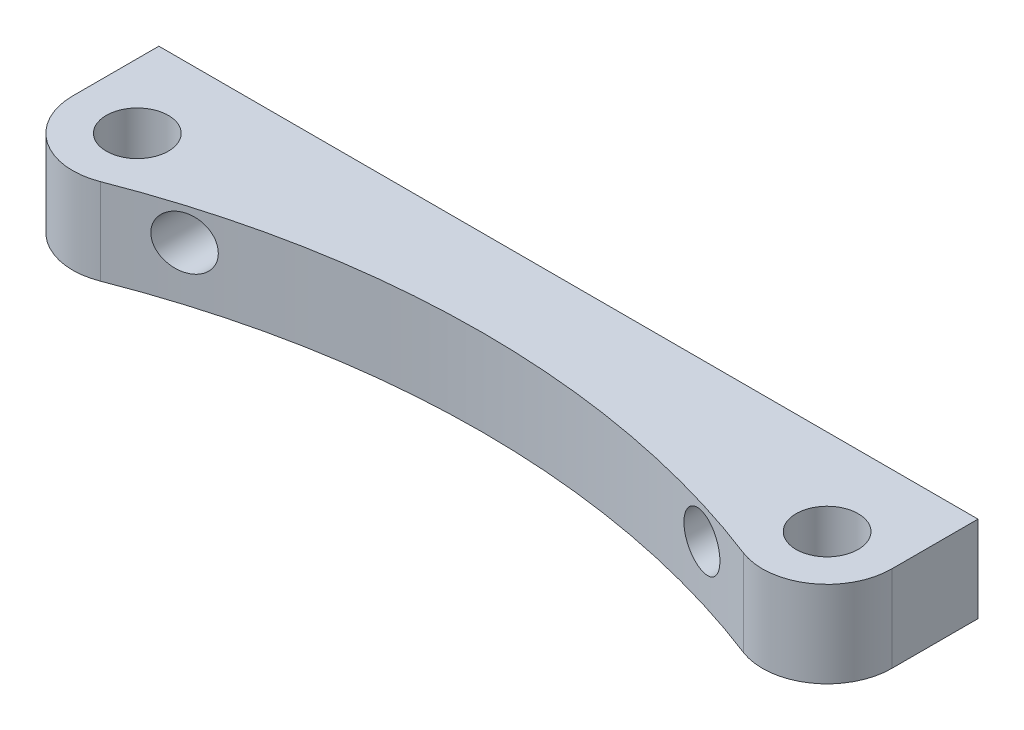
ISO-10303-21;
HEADER;
FILE_DESCRIPTION(('STEP AP214'),'2;1');
FILE_NAME('part.step','',(''),(''),'','','');
FILE_SCHEMA(('AUTOMOTIVE_DESIGN { 1 0 10303 214 1 1 1 1 }'));
ENDSEC;
DATA;
#1=APPLICATION_CONTEXT('core data for automotive mechanical design processes');
#2=APPLICATION_PROTOCOL_DEFINITION('international standard','automotive_design',2000,#1);
#3=PRODUCT_CONTEXT('',#1,'mechanical');
#4=PRODUCT('Part','Part','',(#3));
#5=PRODUCT_RELATED_PRODUCT_CATEGORY('part','',(#4));
#6=PRODUCT_DEFINITION_FORMATION('','',#4);
#7=PRODUCT_DEFINITION_CONTEXT('part definition',#1,'design');
#8=PRODUCT_DEFINITION('design','',#6,#7);
#9=PRODUCT_DEFINITION_SHAPE('','',#8);
#10=(LENGTH_UNIT() NAMED_UNIT(*) SI_UNIT(.MILLI.,.METRE.));
#11=(NAMED_UNIT(*) PLANE_ANGLE_UNIT() SI_UNIT($,.RADIAN.));
#12=(NAMED_UNIT(*) SI_UNIT($,.STERADIAN.) SOLID_ANGLE_UNIT());
#13=UNCERTAINTY_MEASURE_WITH_UNIT(LENGTH_MEASURE(1.E-05),#10,'distance_accuracy_value','');
#14=(GEOMETRIC_REPRESENTATION_CONTEXT(3) GLOBAL_UNCERTAINTY_ASSIGNED_CONTEXT((#13)) GLOBAL_UNIT_ASSIGNED_CONTEXT((#10,
#11,#12)) REPRESENTATION_CONTEXT('',''));
#15=CARTESIAN_POINT('',(0.,0.,0.));
#16=DIRECTION('',(0.,0.,1.));
#17=DIRECTION('',(1.,0.,0.));
#18=AXIS2_PLACEMENT_3D('',#15,#16,#17);
#19=CARTESIAN_POINT('',(25.4,6.35,65.3520833333333));
#20=DIRECTION('',(0.,-1.,0.));
#21=DIRECTION('',(0.,0.,-1.));
#22=AXIS2_PLACEMENT_3D('',#19,#20,#21);
#23=PLANE('',#22);
#24=CARTESIAN_POINT('',(25.4,6.35,65.3520833333333));
#25=DIRECTION('',(0.,-1.,0.));
#26=DIRECTION('',(0.,0.,-1.));
#27=AXIS2_PLACEMENT_3D('',#24,#25,#26);
#28=CIRCLE('',#27,65.3520833333333);
#29=CARTESIAN_POINT('',(1.72528301886792,6.35,4.43900943396227));
#30=VERTEX_POINT('',#29);
#31=CARTESIAN_POINT('',(49.0747169811321,6.35,4.43900943396226));
#32=VERTEX_POINT('',#31);
#33=EDGE_CURVE('E165',#30,#32,#28,.T.);
#34=ORIENTED_EDGE('',*,*,#33,.T.);
#35=CARTESIAN_POINT('',(50.8,6.35,0.));
#36=DIRECTION('',(0.,1.,0.));
#37=DIRECTION('',(0.,0.,1.));
#38=AXIS2_PLACEMENT_3D('',#35,#36,#37);
#39=CIRCLE('',#38,4.7625);
#40=CARTESIAN_POINT('',(55.5625,6.35,0.));
#41=VERTEX_POINT('',#40);
#42=EDGE_CURVE('E109',#32,#41,#39,.T.);
#43=ORIENTED_EDGE('',*,*,#42,.T.);
#44=DIRECTION('',(0.,0.,-1.));
#45=VECTOR('',#44,1.);
#46=CARTESIAN_POINT('',(55.5625,6.35,0.));
#47=LINE('',#46,#45);
#48=CARTESIAN_POINT('',(55.5625,6.35,-6.35));
#49=VERTEX_POINT('',#48);
#50=EDGE_CURVE('E125',#41,#49,#47,.T.);
#51=ORIENTED_EDGE('',*,*,#50,.T.);
#52=DIRECTION('',(-1.,0.,0.));
#53=VECTOR('',#52,1.);
#54=CARTESIAN_POINT('',(-4.7625,6.35,-6.35));
#55=LINE('',#54,#53);
#56=CARTESIAN_POINT('',(-4.7625,6.35,-6.35));
#57=VERTEX_POINT('',#56);
#58=EDGE_CURVE('E119',#49,#57,#55,.T.);
#59=ORIENTED_EDGE('',*,*,#58,.T.);
#60=DIRECTION('',(0.,0.,1.));
#61=VECTOR('',#60,1.);
#62=CARTESIAN_POINT('',(-4.7625,6.35,-6.35));
#63=LINE('',#62,#61);
#64=CARTESIAN_POINT('',(-4.7625,6.35,0.));
#65=VERTEX_POINT('',#64);
#66=EDGE_CURVE('E123',#57,#65,#63,.T.);
#67=ORIENTED_EDGE('',*,*,#66,.T.);
#68=CARTESIAN_POINT('',(0.,6.35,0.));
#69=DIRECTION('',(0.,1.,0.));
#70=DIRECTION('',(0.,0.,1.));
#71=AXIS2_PLACEMENT_3D('',#68,#69,#70);
#72=CIRCLE('',#71,4.7625);
#73=EDGE_CURVE('E66',#65,#30,#72,.T.);
#74=ORIENTED_EDGE('',*,*,#73,.T.);
#75=EDGE_LOOP('',(#34,#43,#51,#59,#67,#74));
#76=FACE_BOUND('',#75,.T.);
#77=CARTESIAN_POINT('',(0.,6.35,0.));
#78=DIRECTION('',(0.,1.,0.));
#79=DIRECTION('',(0.,0.,1.));
#80=AXIS2_PLACEMENT_3D('',#77,#78,#79);
#81=CIRCLE('',#80,2.286);
#82=CARTESIAN_POINT('',(0.,6.35,2.286));
#83=VERTEX_POINT('',#82);
#84=EDGE_CURVE('E154',#83,#83,#81,.T.);
#85=ORIENTED_EDGE('',*,*,#84,.F.);
#86=EDGE_LOOP('',(#85));
#87=FACE_BOUND('',#86,.T.);
#88=CARTESIAN_POINT('',(50.8,6.35,0.));
#89=DIRECTION('',(0.,1.,0.));
#90=DIRECTION('',(0.,0.,1.));
#91=AXIS2_PLACEMENT_3D('',#88,#89,#90);
#92=CIRCLE('',#91,2.28599999999999);
#93=CARTESIAN_POINT('',(50.8,6.35,2.28599999999999));
#94=VERTEX_POINT('',#93);
#95=EDGE_CURVE('E231',#94,#94,#92,.T.);
#96=ORIENTED_EDGE('',*,*,#95,.F.);
#97=EDGE_LOOP('',(#96));
#98=FACE_BOUND('',#97,.T.);
#99=ADVANCED_FACE('F45',(#76,#87,#98),#23,.F.);
#100=CARTESIAN_POINT('',(25.4,0.,65.3520833333333));
#101=DIRECTION('',(0.,-1.,0.));
#102=DIRECTION('',(0.,0.,-1.));
#103=AXIS2_PLACEMENT_3D('',#100,#101,#102);
#104=PLANE('',#103);
#105=CARTESIAN_POINT('',(0.,0.,0.));
#106=DIRECTION('',(0.,1.,0.));
#107=DIRECTION('',(0.,0.,1.));
#108=AXIS2_PLACEMENT_3D('',#105,#106,#107);
#109=CIRCLE('',#108,2.286);
#110=CARTESIAN_POINT('',(0.,0.,2.286));
#111=VERTEX_POINT('',#110);
#112=EDGE_CURVE('E234',#111,#111,#109,.T.);
#113=ORIENTED_EDGE('',*,*,#112,.T.);
#114=EDGE_LOOP('',(#113));
#115=FACE_BOUND('',#114,.T.);
#116=CARTESIAN_POINT('',(25.4,0.,65.3520833333333));
#117=DIRECTION('',(0.,-1.,0.));
#118=DIRECTION('',(0.,0.,-1.));
#119=AXIS2_PLACEMENT_3D('',#116,#117,#118);
#120=CIRCLE('',#119,65.3520833333333);
#121=CARTESIAN_POINT('',(1.72528301886792,0.,4.43900943396227));
#122=VERTEX_POINT('',#121);
#123=CARTESIAN_POINT('',(49.0747169811321,0.,4.43900943396226));
#124=VERTEX_POINT('',#123);
#125=EDGE_CURVE('E149',#122,#124,#120,.T.);
#126=ORIENTED_EDGE('',*,*,#125,.F.);
#127=CARTESIAN_POINT('',(0.,0.,0.));
#128=DIRECTION('',(0.,1.,0.));
#129=DIRECTION('',(0.,0.,1.));
#130=AXIS2_PLACEMENT_3D('',#127,#128,#129);
#131=CIRCLE('',#130,4.7625);
#132=CARTESIAN_POINT('',(-4.7625,0.,0.));
#133=VERTEX_POINT('',#132);
#134=EDGE_CURVE('E101',#133,#122,#131,.T.);
#135=ORIENTED_EDGE('',*,*,#134,.F.);
#136=DIRECTION('',(0.,0.,1.));
#137=VECTOR('',#136,1.);
#138=CARTESIAN_POINT('',(-4.7625,0.,-6.35));
#139=LINE('',#138,#137);
#140=CARTESIAN_POINT('',(-4.7625,0.,-6.35));
#141=VERTEX_POINT('',#140);
#142=EDGE_CURVE('E95',#141,#133,#139,.T.);
#143=ORIENTED_EDGE('',*,*,#142,.F.);
#144=DIRECTION('',(-1.,0.,0.));
#145=VECTOR('',#144,1.);
#146=CARTESIAN_POINT('',(-4.7625,0.,-6.35));
#147=LINE('',#146,#145);
#148=CARTESIAN_POINT('',(55.5625,0.,-6.35));
#149=VERTEX_POINT('',#148);
#150=EDGE_CURVE('E134',#149,#141,#147,.T.);
#151=ORIENTED_EDGE('',*,*,#150,.F.);
#152=DIRECTION('',(0.,0.,-1.));
#153=VECTOR('',#152,1.);
#154=CARTESIAN_POINT('',(55.5625,0.,0.));
#155=LINE('',#154,#153);
#156=CARTESIAN_POINT('',(55.5625,0.,0.));
#157=VERTEX_POINT('',#156);
#158=EDGE_CURVE('E157',#157,#149,#155,.T.);
#159=ORIENTED_EDGE('',*,*,#158,.F.);
#160=CARTESIAN_POINT('',(50.8,0.,0.));
#161=DIRECTION('',(0.,1.,0.));
#162=DIRECTION('',(0.,0.,1.));
#163=AXIS2_PLACEMENT_3D('',#160,#161,#162);
#164=CIRCLE('',#163,4.7625);
#165=EDGE_CURVE('E153',#124,#157,#164,.T.);
#166=ORIENTED_EDGE('',*,*,#165,.F.);
#167=EDGE_LOOP('',(#126,#135,#143,#151,#159,#166));
#168=FACE_BOUND('',#167,.T.);
#169=CARTESIAN_POINT('',(50.8,0.,0.));
#170=DIRECTION('',(0.,1.,0.));
#171=DIRECTION('',(0.,0.,1.));
#172=AXIS2_PLACEMENT_3D('',#169,#170,#171);
#173=CIRCLE('',#172,2.28599999999999);
#174=CARTESIAN_POINT('',(50.8,0.,2.28599999999999));
#175=VERTEX_POINT('',#174);
#176=EDGE_CURVE('E235',#175,#175,#173,.T.);
#177=ORIENTED_EDGE('',*,*,#176,.T.);
#178=EDGE_LOOP('',(#177));
#179=FACE_BOUND('',#178,.T.);
#180=ADVANCED_FACE('F178',(#115,#168,#179),#104,.T.);
#181=CARTESIAN_POINT('',(25.4,6.35,65.3520833333333));
#182=DIRECTION('',(0.,-1.,0.));
#183=DIRECTION('',(0.,0.,-1.));
#184=AXIS2_PLACEMENT_3D('',#181,#182,#183);
#185=CYLINDRICAL_SURFACE('',#184,65.3520833333333);
#186=CARTESIAN_POINT('',(4.44500000000001,3.96875000000114,3.4506877835806));
#187=CARTESIAN_POINT('',(4.44500526025842,3.86580721428467,3.45068576303521));
#188=CARTESIAN_POINT('',(4.45338011419821,3.76278563253451,3.44784896973304));
#189=CARTESIAN_POINT('',(4.48659194470384,3.55966157787404,3.43662118243721));
#190=CARTESIAN_POINT('',(4.51144952634682,3.45956292264863,3.42822323645762));
#191=CARTESIAN_POINT('',(4.57666492182714,3.26534365803786,3.40626276633443));
#192=CARTESIAN_POINT('',(4.6169969273315,3.17121339750449,3.39270884168087));
#193=CARTESIAN_POINT('',(4.71175923860379,2.99123307937674,3.36100353421809));
#194=CARTESIAN_POINT('',(4.76618751860219,2.90538183443948,3.34285281202096));
#195=CARTESIAN_POINT('',(4.88886565886284,2.74205166705979,3.30216450761695));
#196=CARTESIAN_POINT('',(4.95741311198408,2.66482004740458,3.27953296581455));
#197=CARTESIAN_POINT('',(5.10542276402552,2.52286807062076,3.23098393096233));
#198=CARTESIAN_POINT('',(5.18488756480302,2.45815070480738,3.2050656547211));
#199=CARTESIAN_POINT('',(5.35670311682752,2.33970055367038,3.14943402166661));
#200=CARTESIAN_POINT('',(5.44949635069849,2.28666778626967,3.11959647717944));
#201=CARTESIAN_POINT('',(5.6421399627345,2.19695522480582,3.05816721660841));
#202=CARTESIAN_POINT('',(5.7419919698629,2.16027921978256,3.02657509598144));
#203=CARTESIAN_POINT('',(5.9504065812174,2.10286934966305,2.96121449243142));
#204=CARTESIAN_POINT('',(6.05915875490684,2.0828625510928,2.92741015451493));
#205=CARTESIAN_POINT('',(6.27851340694779,2.06190511739777,2.85987005839934));
#206=CARTESIAN_POINT('',(6.38911611662742,2.06095688279196,2.82613430937441));
#207=CARTESIAN_POINT('',(6.61088076079701,2.07837186689689,2.75913310086106));
#208=CARTESIAN_POINT('',(6.72202372043538,2.09704175585941,2.72588359815574));
#209=CARTESIAN_POINT('',(6.93981856816563,2.15386640179247,2.66133917890188));
#210=CARTESIAN_POINT('',(7.04647062463011,2.19202042755983,2.63004418905359));
#211=CARTESIAN_POINT('',(7.25049964679196,2.28631946901828,2.5707041708875));
#212=CARTESIAN_POINT('',(7.34798807341334,2.34219745671342,2.54261882677844));
#213=CARTESIAN_POINT('',(7.532243242904,2.47077195294616,2.48995438400127));
#214=CARTESIAN_POINT('',(7.61901199737569,2.54346529861743,2.46537462735728));
#215=CARTESIAN_POINT('',(7.77605012885177,2.70094068410633,2.42118768650758));
#216=CARTESIAN_POINT('',(7.84678767239206,2.78521552796348,2.40143751425776));
#217=CARTESIAN_POINT('',(7.97302857602193,2.96531246037226,2.3663724926002));
#218=CARTESIAN_POINT('',(8.0285354652526,3.06113186648054,2.35105661566302));
#219=CARTESIAN_POINT('',(8.12050547507896,3.25765444516632,2.32577086310097));
#220=CARTESIAN_POINT('',(8.15761297803593,3.35803295605548,2.31561970982587));
#221=CARTESIAN_POINT('',(8.21454930612532,3.56392572979204,2.30007335887524));
#222=CARTESIAN_POINT('',(8.23438116850122,3.66943908643274,2.29467732519659));
#223=CARTESIAN_POINT('',(8.25576292052472,3.87958214959514,2.28886068977561));
#224=CARTESIAN_POINT('',(8.25778620442776,3.98416039455759,2.28831125311307));
#225=CARTESIAN_POINT('',(8.24472168127135,4.19215706602718,2.29186396575841));
#226=CARTESIAN_POINT('',(8.22963510189409,4.29557557521103,2.29596578132547));
#227=CARTESIAN_POINT('',(8.1830478293516,4.49754467372977,2.30867031923204));
#228=CARTESIAN_POINT('',(8.15166859115708,4.59612545458839,2.31723973935294));
#229=CARTESIAN_POINT('',(8.07361584023433,4.78652840501076,2.33864955949564));
#230=CARTESIAN_POINT('',(8.02694177488059,4.87835033021987,2.35149011384032));
#231=CARTESIAN_POINT('',(7.91908791596882,5.05399128737243,2.38133085099528));
#232=CARTESIAN_POINT('',(7.85772451690057,5.13768847590475,2.39838377908854));
#233=CARTESIAN_POINT('',(7.72275744519374,5.29358851234659,2.43614900707655));
#234=CARTESIAN_POINT('',(7.64915224313531,5.36578992183129,2.45686176422932));
#235=CARTESIAN_POINT('',(7.48952761556459,5.4989869293013,2.50212831554063));
#236=CARTESIAN_POINT('',(7.4032038678005,5.55958497314403,2.52677809531899));
#237=CARTESIAN_POINT('',(7.22240425594267,5.6654875896828,2.57885133300204));
#238=CARTESIAN_POINT('',(7.12792694220517,5.71078943576551,2.60627528428373));
#239=CARTESIAN_POINT('',(6.92974425517082,5.78660439454486,2.66432142736877));
#240=CARTESIAN_POINT('',(6.82582547439625,5.81649739905531,2.69502510249701));
#241=CARTESIAN_POINT('',(6.61487572462322,5.85830934992031,2.75794605239536));
#242=CARTESIAN_POINT('',(6.50784416919806,5.87022488678322,2.79016361308494));
#243=CARTESIAN_POINT('',(6.29003295953858,5.87601925427954,2.85634493593768));
#244=CARTESIAN_POINT('',(6.17924405506847,5.86930218780571,2.89033147239908));
#245=CARTESIAN_POINT('',(5.96042672179684,5.83676931376421,2.95808591379272));
#246=CARTESIAN_POINT('',(5.85239863225002,5.81095117057971,2.99185379147866));
#247=CARTESIAN_POINT('',(5.64085704458768,5.740393020123,3.0585562670018));
#248=CARTESIAN_POINT('',(5.53741257029161,5.69543149277177,3.09147616640282));
#249=CARTESIAN_POINT('',(5.339515696401,5.58758931209914,3.15495660073083));
#250=CARTESIAN_POINT('',(5.24506253751057,5.52471017367284,3.18551733484263));
#251=CARTESIAN_POINT('',(5.06987821268785,5.38391707253801,3.24258902998064));
#252=CARTESIAN_POINT('',(4.98891798403368,5.30631568401922,3.26916660030602));
#253=CARTESIAN_POINT('',(4.8413085480286,5.13727694054365,3.31789066554494));
#254=CARTESIAN_POINT('',(4.77465923451023,5.04583968823869,3.34003719333068));
#255=CARTESIAN_POINT('',(4.66084813706762,4.85614830931712,3.37800952448282));
#256=CARTESIAN_POINT('',(4.6129425043016,4.75838819698614,3.39407551520567));
#257=CARTESIAN_POINT('',(4.53438034948345,4.55555112544265,3.42048839681013));
#258=CARTESIAN_POINT('',(4.5036948272215,4.45048680466459,3.43084490245502));
#259=CARTESIAN_POINT('',(4.46986174311586,4.28190072694056,3.44227585416534));
#260=CARTESIAN_POINT('',(4.46055350476412,4.21968809009831,3.4454244052316));
#261=CARTESIAN_POINT('',(4.44812110185058,4.09457677228922,3.44963096167639));
#262=CARTESIAN_POINT('',(4.44499678444577,4.031678108317,3.45068901872398));
#263=CARTESIAN_POINT('',(4.44500000000001,3.96875000000114,3.4506877835806));
#264=B_SPLINE_CURVE_WITH_KNOTS('',3,(#186,#187,#188,#189,#190,#191,#192,#193,#194,#195,#196,
#197,#198,#199,#200,#201,#202,#203,#204,#205,#206,#207,#208,#209,#210,#211,#212,#213,#214,#215,
#216,#217,#218,#219,#220,#221,#222,#223,#224,#225,#226,#227,#228,#229,#230,#231,#232,#233,#234,
#235,#236,#237,#238,#239,#240,#241,#242,#243,#244,#245,#246,#247,#248,#249,#250,#251,#252,#253,
#254,#255,#256,#257,#258,#259,#260,#261,#262,#263),.UNSPECIFIED.,.T.,.F.,(4,2,2,2,2,2,2,2,2,2,2,
2,2,2,2,2,2,2,2,2,2,2,2,2,2,2,2,2,2,2,2,2,2,2,2,2,2,2,4),(0.,0.308591258986354,
0.617569017387571,0.926033685333858,1.23445404852988,1.55020025394281,1.8660218399623,
2.19743494287894,2.52892477773129,2.87421163121227,3.21954197498182,3.57035197335584,
3.92114880745476,4.26689331959875,4.61257285211167,4.94625349300115,5.27985675031989,
5.60076347769871,5.92161377482876,6.23390848054509,6.54618077963017,6.8561579482784,
7.16614631811143,7.48023266260613,7.79435827674391,8.11783477071175,8.44136889535924,
8.77706800752095,9.11283077823164,9.45945439955588,9.80612041188304,10.1569118634408,
10.5076736651387,10.8516862526775,11.1956962880239,11.5241780244045,11.8521048950922,
12.0407489464352,12.2293883351565),.UNSPECIFIED.);
#265=CARTESIAN_POINT('',(4.44500000000001,3.96875000000114,3.4506877835806));
#266=VERTEX_POINT('',#265);
#267=EDGE_CURVE('E221',#266,#266,#264,.T.);
#268=ORIENTED_EDGE('',*,*,#267,.F.);
#269=EDGE_LOOP('',(#268));
#270=FACE_BOUND('',#269,.T.);
#271=CARTESIAN_POINT('',(42.545,3.96875000000116,2.28906904597988));
#272=CARTESIAN_POINT('',(42.5450050643086,3.86460572202915,2.28907018508278));
#273=CARTESIAN_POINT('',(42.5535740323395,3.76038300209166,2.29139813684974));
#274=CARTESIAN_POINT('',(42.5875846605637,3.55485332625416,2.30065965930492));
#275=CARTESIAN_POINT('',(42.6130471336012,3.45355012805246,2.3075989111443));
#276=CARTESIAN_POINT('',(42.679946656476,3.25691840287198,2.32590279556924));
#277=CARTESIAN_POINT('',(42.7213652036646,3.1615831038282,2.33726230258428));
#278=CARTESIAN_POINT('',(42.8187952718039,2.97937066291823,2.36412489405095));
#279=CARTESIAN_POINT('',(42.8748038587474,2.89249182530618,2.37962714542701));
#280=CARTESIAN_POINT('',(43.0005300925144,2.7282221756436,2.41465058197506));
#281=CARTESIAN_POINT('',(43.0704296348869,2.65098215429581,2.43422527323091));
#282=CARTESIAN_POINT('',(43.2212811022936,2.50930213150605,2.47678715608142));
#283=CARTESIAN_POINT('',(43.3022349298877,2.44486433816051,2.49977493516435));
#284=CARTESIAN_POINT('',(43.4757266597538,2.32829296421746,2.54944566201452));
#285=CARTESIAN_POINT('',(43.5685615814364,2.27664335971942,2.57622653110682));
#286=CARTESIAN_POINT('',(43.7608874189924,2.18962205299311,2.6322089740827));
#287=CARTESIAN_POINT('',(43.8603795899909,2.15425343026119,2.66141100468965));
#288=CARTESIAN_POINT('',(44.0671556650734,2.09944043124734,2.72266419727761));
#289=CARTESIAN_POINT('',(44.1745918584485,2.08064352937723,2.75478115680512));
#290=CARTESIAN_POINT('',(44.3907943374296,2.06157866737181,2.82003327983481));
#291=CARTESIAN_POINT('',(44.4995608504148,2.06131392031177,2.85316861890569));
#292=CARTESIAN_POINT('',(44.7184996334404,2.07948405555549,2.92049007628441));
#293=CARTESIAN_POINT('',(44.8286284098643,2.09843295752609,2.9546800497374));
#294=CARTESIAN_POINT('',(45.0441505685323,2.15534595376294,3.02219558992482));
#295=CARTESIAN_POINT('',(45.1495435584797,2.19331162016221,3.05552108495241));
#296=CARTESIAN_POINT('',(45.3528246891312,2.28752581576697,3.12033097141375));
#297=CARTESIAN_POINT('',(45.4506918480246,2.34382332087265,3.15181016133973));
#298=CARTESIAN_POINT('',(45.6355676235567,2.47336106620977,3.21170956388303));
#299=CARTESIAN_POINT('',(45.7225775680184,2.54659923148857,3.24013015050485));
#300=CARTESIAN_POINT('',(45.8804666768501,2.70581927457704,3.29201563677613));
#301=CARTESIAN_POINT('',(45.951740159682,2.79137044931782,3.31560026047776));
#302=CARTESIAN_POINT('',(46.0787217171382,2.974423206599,3.35781135946427));
#303=CARTESIAN_POINT('',(46.1344348244938,3.07192091053105,3.3764394377646));
#304=CARTESIAN_POINT('',(46.2257739752314,3.27087346536213,3.40707425553223));
#305=CARTESIAN_POINT('',(46.262263551845,3.37188816451497,3.41936498781935));
#306=CARTESIAN_POINT('',(46.3178078254844,3.57911568064327,3.43810281379766));
#307=CARTESIAN_POINT('',(46.3368678298717,3.68532690487474,3.44455168634861));
#308=CARTESIAN_POINT('',(46.3563494493398,3.89492754559221,3.45114382238518));
#309=CARTESIAN_POINT('',(46.3575504562301,3.99823695172961,3.45155076303913));
#310=CARTESIAN_POINT('',(46.3432718790741,4.20355375202819,3.44671833937602));
#311=CARTESIAN_POINT('',(46.3277941031603,4.30556128611126,3.44147958710363));
#312=CARTESIAN_POINT('',(46.281043149417,4.50407850750082,3.42569619250922));
#313=CARTESIAN_POINT('',(46.2499714420569,4.60064127136061,3.41521923313396));
#314=CARTESIAN_POINT('',(46.1732315688996,4.78707958909985,3.38943914091974));
#315=CARTESIAN_POINT('',(46.1275621647891,4.87695457486168,3.37413559864631));
#316=CARTESIAN_POINT('',(46.0218503762254,5.04987294596122,3.33888111071076));
#317=CARTESIAN_POINT('',(45.9614878221304,5.13269920864278,3.31882695276512));
#318=CARTESIAN_POINT('',(45.828891037835,5.28710013842018,3.2750338366446));
#319=CARTESIAN_POINT('',(45.7566543556701,5.35867247563619,3.25129411747104));
#320=CARTESIAN_POINT('',(45.5987343608216,5.49210546737901,3.1997452519829));
#321=CARTESIAN_POINT('',(45.5125800660071,5.55335511103996,3.17179768104066));
#322=CARTESIAN_POINT('',(45.3319285220106,5.66057379163353,3.11365449310086));
#323=CARTESIAN_POINT('',(45.2374293133192,5.70653922746831,3.08345834836718));
#324=CARTESIAN_POINT('',(45.038046129112,5.78401443848769,3.02028278329888));
#325=CARTESIAN_POINT('',(44.9328839955136,5.81475728989814,2.98723922792261));
#326=CARTESIAN_POINT('',(44.7189988017785,5.85781597051453,2.92065190483882));
#327=CARTESIAN_POINT('',(44.610275136366,5.87012865076935,2.88710805263993));
#328=CARTESIAN_POINT('',(44.3894713787565,5.87606637249087,2.8196244093246));
#329=CARTESIAN_POINT('',(44.2773748978053,5.86922056573151,2.7856954180422));
#330=CARTESIAN_POINT('',(44.0557070272246,5.83586538502221,2.71924223647327));
#331=CARTESIAN_POINT('',(43.9461356755707,5.80935571554528,2.68671806730749));
#332=CARTESIAN_POINT('',(43.7334001615352,5.73737795162032,2.6241512474212));
#333=CARTESIAN_POINT('',(43.6302026458715,5.6920202488108,2.59409534816041));
#334=CARTESIAN_POINT('',(43.4327792794151,5.58336300194184,2.53708327602252));
#335=CARTESIAN_POINT('',(43.3385517269284,5.5200668700846,2.51012651500472));
#336=CARTESIAN_POINT('',(43.1649134568008,5.37931304158472,2.46082352034094));
#337=CARTESIAN_POINT('',(43.0851395010909,5.3023441296004,2.43836207576737));
#338=CARTESIAN_POINT('',(42.9396972383334,5.13506311357343,2.39765905473712));
#339=CARTESIAN_POINT('',(42.8740294110053,5.04475055591795,2.37941762179245));
#340=CARTESIAN_POINT('',(42.7614057193421,4.8571154361563,2.3482764498502));
#341=CARTESIAN_POINT('',(42.7138288586598,4.76019450360849,2.3351986931294));
#342=CARTESIAN_POINT('',(42.6356666250264,4.55933941909281,2.31377551427494));
#343=CARTESIAN_POINT('',(42.6050558272925,4.45541602436086,2.30542301064158));
#344=CARTESIAN_POINT('',(42.5706880639746,4.28703361124477,2.29605723924613));
#345=CARTESIAN_POINT('',(42.5610692365,4.22379937594162,2.29343964885791));
#346=CARTESIAN_POINT('',(42.5482237018417,4.09663661442816,2.28994521671631));
#347=CARTESIAN_POINT('',(42.5449968898575,4.03270809961823,2.28906834642289));
#348=CARTESIAN_POINT('',(42.545,3.96875000000116,2.28906904597988));
#349=B_SPLINE_CURVE_WITH_KNOTS('',3,(#271,#272,#273,#274,#275,#276,#277,#278,#279,#280,#281,
#282,#283,#284,#285,#286,#287,#288,#289,#290,#291,#292,#293,#294,#295,#296,#297,#298,#299,#300,
#301,#302,#303,#304,#305,#306,#307,#308,#309,#310,#311,#312,#313,#314,#315,#316,#317,#318,#319,
#320,#321,#322,#323,#324,#325,#326,#327,#328,#329,#330,#331,#332,#333,#334,#335,#336,#337,#338,
#339,#340,#341,#342,#343,#344,#345,#346,#347,#348),.UNSPECIFIED.,.T.,.F.,(4,2,2,2,2,2,2,2,2,2,2,
2,2,2,2,2,2,2,2,2,2,2,2,2,2,2,2,2,2,2,2,2,2,2,2,2,2,2,4),(0.,0.312195050028622,
0.624775441208668,0.936994450241489,1.24915072150064,1.5657015223318,1.88230687374917,
2.20950840130932,2.53677179260176,2.87631774369116,3.21592256456705,3.56485888985697,
3.91382406678881,4.26372930588894,4.61359171001709,4.95331753369235,5.29293335141337,
5.61560432849789,5.93817701846602,6.24662870755526,6.55504696102758,6.85957931307748,
7.16413750527213,7.47604320884716,7.78801340091584,8.1145789219609,8.44122133037308,
8.78297141338334,9.12477988063271,9.47506204503133,9.82534947390553,10.1736135815759,
10.5218114877489,10.8594284826698,11.1970569574112,11.5217380784013,11.845931318263,
12.0376627305215,12.2293909992129),.UNSPECIFIED.);
#350=CARTESIAN_POINT('',(42.545,3.96875000000116,2.28906904597988));
#351=VERTEX_POINT('',#350);
#352=EDGE_CURVE('E212',#351,#351,#349,.T.);
#353=ORIENTED_EDGE('',*,*,#352,.F.);
#354=EDGE_LOOP('',(#353));
#355=FACE_BOUND('',#354,.T.);
#356=ORIENTED_EDGE('',*,*,#125,.T.);
#357=DIRECTION('',(0.,-1.,0.));
#358=VECTOR('',#357,1.);
#359=CARTESIAN_POINT('',(49.0747169811321,6.35,4.43900943396226));
#360=LINE('',#359,#358);
#361=EDGE_CURVE('E11',#32,#124,#360,.T.);
#362=ORIENTED_EDGE('',*,*,#361,.F.);
#363=ORIENTED_EDGE('',*,*,#33,.F.);
#364=DIRECTION('',(0.,-1.,0.));
#365=VECTOR('',#364,1.);
#366=CARTESIAN_POINT('',(1.72528301886792,6.35,4.43900943396227));
#367=LINE('',#366,#365);
#368=EDGE_CURVE('E145',#30,#122,#367,.T.);
#369=ORIENTED_EDGE('',*,*,#368,.T.);
#370=EDGE_LOOP('',(#356,#362,#363,#369));
#371=FACE_BOUND('',#370,.T.);
#372=ADVANCED_FACE('F47',(#270,#355,#371),#185,.F.);
#373=CARTESIAN_POINT('',(50.8,6.35,0.));
#374=DIRECTION('',(0.,-1.,0.));
#375=DIRECTION('',(0.,0.,-1.));
#376=AXIS2_PLACEMENT_3D('',#373,#374,#375);
#377=CYLINDRICAL_SURFACE('',#376,4.7625);
#378=ORIENTED_EDGE('',*,*,#165,.T.);
#379=DIRECTION('',(0.,-1.,0.));
#380=VECTOR('',#379,1.);
#381=CARTESIAN_POINT('',(55.5625,6.35,0.));
#382=LINE('',#381,#380);
#383=EDGE_CURVE('E55',#41,#157,#382,.T.);
#384=ORIENTED_EDGE('',*,*,#383,.F.);
#385=ORIENTED_EDGE('',*,*,#42,.F.);
#386=ORIENTED_EDGE('',*,*,#361,.T.);
#387=EDGE_LOOP('',(#378,#384,#385,#386));
#388=FACE_BOUND('',#387,.T.);
#389=ADVANCED_FACE('F258',(#388),#377,.T.);
#390=CARTESIAN_POINT('',(55.5625,6.35,0.));
#391=DIRECTION('',(-1.,0.,0.));
#392=DIRECTION('',(0.,0.,1.));
#393=AXIS2_PLACEMENT_3D('',#390,#391,#392);
#394=PLANE('',#393);
#395=ORIENTED_EDGE('',*,*,#158,.T.);
#396=DIRECTION('',(0.,-1.,0.));
#397=VECTOR('',#396,1.);
#398=CARTESIAN_POINT('',(55.5625,6.35,-6.35));
#399=LINE('',#398,#397);
#400=EDGE_CURVE('E136',#49,#149,#399,.T.);
#401=ORIENTED_EDGE('',*,*,#400,.F.);
#402=ORIENTED_EDGE('',*,*,#50,.F.);
#403=ORIENTED_EDGE('',*,*,#383,.T.);
#404=EDGE_LOOP('',(#395,#401,#402,#403));
#405=FACE_BOUND('',#404,.T.);
#406=ADVANCED_FACE('F175',(#405),#394,.F.);
#407=CARTESIAN_POINT('',(-4.7625,6.35,-6.35));
#408=DIRECTION('',(0.,0.,1.));
#409=DIRECTION('',(1.,0.,0.));
#410=AXIS2_PLACEMENT_3D('',#407,#408,#409);
#411=PLANE('',#410);
#412=CARTESIAN_POINT('',(6.35000000000002,3.96875000000114,-6.35));
#413=DIRECTION('',(0.,0.,-1.));
#414=DIRECTION('',(-1.,0.,0.));
#415=AXIS2_PLACEMENT_3D('',#412,#413,#414);
#416=CIRCLE('',#415,1.905);
#417=CARTESIAN_POINT('',(4.44500000000001,3.96875000000114,-6.35));
#418=VERTEX_POINT('',#417);
#419=EDGE_CURVE('E230',#418,#418,#416,.T.);
#420=ORIENTED_EDGE('',*,*,#419,.F.);
#421=EDGE_LOOP('',(#420));
#422=FACE_BOUND('',#421,.T.);
#423=CARTESIAN_POINT('',(44.45,3.96875000000116,-6.35));
#424=DIRECTION('',(0.,0.,-1.));
#425=DIRECTION('',(-1.,0.,0.));
#426=AXIS2_PLACEMENT_3D('',#423,#424,#425);
#427=CIRCLE('',#426,1.905);
#428=CARTESIAN_POINT('',(42.545,3.96875000000116,-6.35));
#429=VERTEX_POINT('',#428);
#430=EDGE_CURVE('E220',#429,#429,#427,.T.);
#431=ORIENTED_EDGE('',*,*,#430,.F.);
#432=EDGE_LOOP('',(#431));
#433=FACE_BOUND('',#432,.T.);
#434=ORIENTED_EDGE('',*,*,#150,.T.);
#435=DIRECTION('',(0.,-1.,0.));
#436=VECTOR('',#435,1.);
#437=CARTESIAN_POINT('',(-4.7625,6.35,-6.35));
#438=LINE('',#437,#436);
#439=EDGE_CURVE('E131',#57,#141,#438,.T.);
#440=ORIENTED_EDGE('',*,*,#439,.F.);
#441=ORIENTED_EDGE('',*,*,#58,.F.);
#442=ORIENTED_EDGE('',*,*,#400,.T.);
#443=EDGE_LOOP('',(#434,#440,#441,#442));
#444=FACE_BOUND('',#443,.T.);
#445=ADVANCED_FACE('F132',(#422,#433,#444),#411,.F.);
#446=CARTESIAN_POINT('',(-4.7625,6.35,-6.35));
#447=DIRECTION('',(1.,0.,0.));
#448=DIRECTION('',(0.,0.,-1.));
#449=AXIS2_PLACEMENT_3D('',#446,#447,#448);
#450=PLANE('',#449);
#451=ORIENTED_EDGE('',*,*,#142,.T.);
#452=DIRECTION('',(0.,-1.,0.));
#453=VECTOR('',#452,1.);
#454=CARTESIAN_POINT('',(-4.7625,6.35,0.));
#455=LINE('',#454,#453);
#456=EDGE_CURVE('E137',#65,#133,#455,.T.);
#457=ORIENTED_EDGE('',*,*,#456,.F.);
#458=ORIENTED_EDGE('',*,*,#66,.F.);
#459=ORIENTED_EDGE('',*,*,#439,.T.);
#460=EDGE_LOOP('',(#451,#457,#458,#459));
#461=FACE_BOUND('',#460,.T.);
#462=ADVANCED_FACE('F139',(#461),#450,.F.);
#463=CARTESIAN_POINT('',(0.,6.35,0.));
#464=DIRECTION('',(0.,-1.,0.));
#465=DIRECTION('',(0.,0.,-1.));
#466=AXIS2_PLACEMENT_3D('',#463,#464,#465);
#467=CYLINDRICAL_SURFACE('',#466,4.7625);
#468=ORIENTED_EDGE('',*,*,#134,.T.);
#469=ORIENTED_EDGE('',*,*,#368,.F.);
#470=ORIENTED_EDGE('',*,*,#73,.F.);
#471=ORIENTED_EDGE('',*,*,#456,.T.);
#472=EDGE_LOOP('',(#468,#469,#470,#471));
#473=FACE_BOUND('',#472,.T.);
#474=ADVANCED_FACE('F183',(#473),#467,.T.);
#475=CARTESIAN_POINT('',(0.,6.35,0.));
#476=DIRECTION('',(0.,-1.,0.));
#477=DIRECTION('',(0.,0.,-1.));
#478=AXIS2_PLACEMENT_3D('',#475,#476,#477);
#479=CYLINDRICAL_SURFACE('',#478,2.286);
#480=ORIENTED_EDGE('',*,*,#84,.T.);
#481=EDGE_LOOP('',(#480));
#482=FACE_BOUND('',#481,.T.);
#483=ORIENTED_EDGE('',*,*,#112,.F.);
#484=EDGE_LOOP('',(#483));
#485=FACE_BOUND('',#484,.T.);
#486=ADVANCED_FACE('F185',(#482,#485),#479,.F.);
#487=CARTESIAN_POINT('',(50.8,6.35,0.));
#488=DIRECTION('',(0.,-1.,0.));
#489=DIRECTION('',(0.,0.,-1.));
#490=AXIS2_PLACEMENT_3D('',#487,#488,#489);
#491=CYLINDRICAL_SURFACE('',#490,2.28599999999999);
#492=ORIENTED_EDGE('',*,*,#95,.T.);
#493=EDGE_LOOP('',(#492));
#494=FACE_BOUND('',#493,.T.);
#495=ORIENTED_EDGE('',*,*,#176,.F.);
#496=EDGE_LOOP('',(#495));
#497=FACE_BOUND('',#496,.T.);
#498=ADVANCED_FACE('F191',(#494,#497),#491,.F.);
#499=CARTESIAN_POINT('',(44.45,3.96875000000116,4.7635));
#500=DIRECTION('',(0.,0.,-1.));
#501=DIRECTION('',(-1.,0.,0.));
#502=AXIS2_PLACEMENT_3D('',#499,#500,#501);
#503=CYLINDRICAL_SURFACE('',#502,1.905);
#504=ORIENTED_EDGE('',*,*,#430,.T.);
#505=EDGE_LOOP('',(#504));
#506=FACE_BOUND('',#505,.T.);
#507=ORIENTED_EDGE('',*,*,#352,.T.);
#508=EDGE_LOOP('',(#507));
#509=FACE_BOUND('',#508,.T.);
#510=ADVANCED_FACE('F205',(#506,#509),#503,.F.);
#511=CARTESIAN_POINT('',(6.35000000000002,3.96875000000114,4.7635));
#512=DIRECTION('',(0.,0.,-1.));
#513=DIRECTION('',(-1.,0.,0.));
#514=AXIS2_PLACEMENT_3D('',#511,#512,#513);
#515=CYLINDRICAL_SURFACE('',#514,1.905);
#516=ORIENTED_EDGE('',*,*,#419,.T.);
#517=EDGE_LOOP('',(#516));
#518=FACE_BOUND('',#517,.T.);
#519=ORIENTED_EDGE('',*,*,#267,.T.);
#520=EDGE_LOOP('',(#519));
#521=FACE_BOUND('',#520,.T.);
#522=ADVANCED_FACE('F255',(#518,#521),#515,.F.);
#523=CLOSED_SHELL('',(#99,#180,#372,#389,#406,#445,#462,#474,#486,#498,#510,#522));
#524=MANIFOLD_SOLID_BREP('B2',#523);
#525=ADVANCED_BREP_SHAPE_REPRESENTATION('',(#18,#524),#14);
#526=SHAPE_DEFINITION_REPRESENTATION(#9,#525);
ENDSEC;
END-ISO-10303-21;
